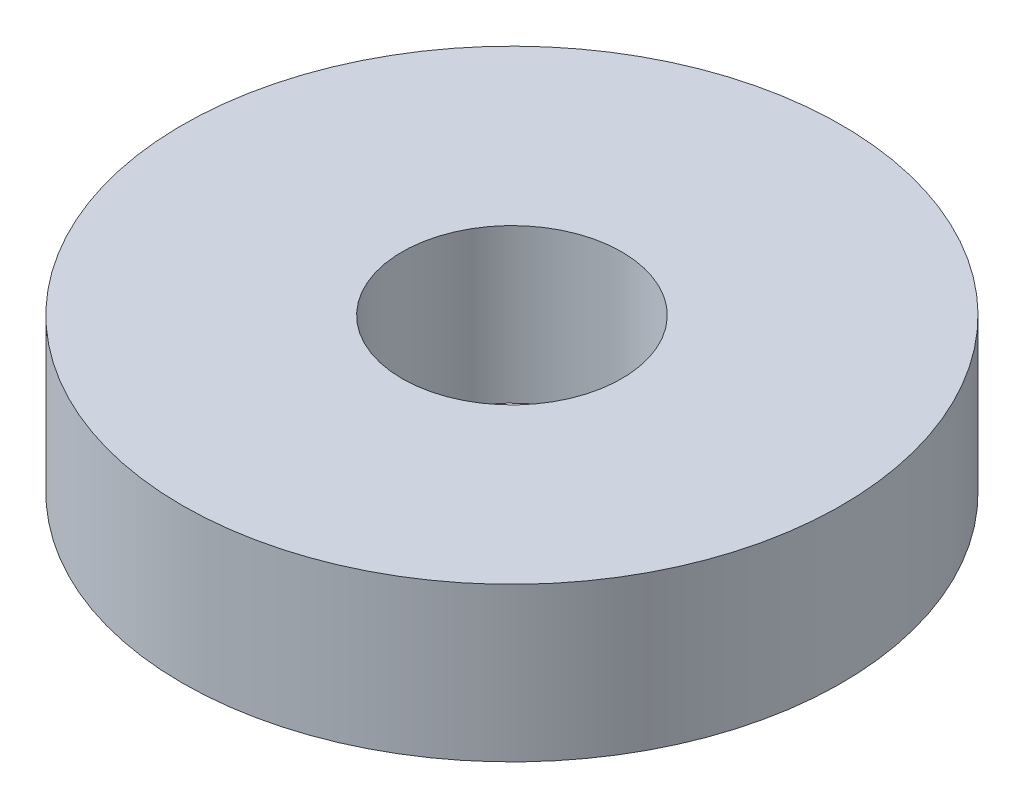
ISO-10303-21;
HEADER;
FILE_DESCRIPTION(('STEP AP214'),'2;1');
FILE_NAME('part.step','',(''),(''),'','','');
FILE_SCHEMA(('AUTOMOTIVE_DESIGN { 1 0 10303 214 1 1 1 1 }'));
ENDSEC;
DATA;
#1=APPLICATION_CONTEXT('core data for automotive mechanical design processes');
#2=APPLICATION_PROTOCOL_DEFINITION('international standard','automotive_design',2000,#1);
#3=PRODUCT_CONTEXT('',#1,'mechanical');
#4=PRODUCT('Part','Part','',(#3));
#5=PRODUCT_RELATED_PRODUCT_CATEGORY('part','',(#4));
#6=PRODUCT_DEFINITION_FORMATION('','',#4);
#7=PRODUCT_DEFINITION_CONTEXT('part definition',#1,'design');
#8=PRODUCT_DEFINITION('design','',#6,#7);
#9=PRODUCT_DEFINITION_SHAPE('','',#8);
#10=(LENGTH_UNIT() NAMED_UNIT(*) SI_UNIT(.MILLI.,.METRE.));
#11=(NAMED_UNIT(*) PLANE_ANGLE_UNIT() SI_UNIT($,.RADIAN.));
#12=(NAMED_UNIT(*) SI_UNIT($,.STERADIAN.) SOLID_ANGLE_UNIT());
#13=UNCERTAINTY_MEASURE_WITH_UNIT(LENGTH_MEASURE(1.E-05),#10,'distance_accuracy_value','');
#14=(GEOMETRIC_REPRESENTATION_CONTEXT(3) GLOBAL_UNCERTAINTY_ASSIGNED_CONTEXT((#13)) GLOBAL_UNIT_ASSIGNED_CONTEXT((#10,
#11,#12)) REPRESENTATION_CONTEXT('',''));
#15=CARTESIAN_POINT('',(0.,0.,0.));
#16=DIRECTION('',(0.,0.,1.));
#17=DIRECTION('',(1.,0.,0.));
#18=AXIS2_PLACEMENT_3D('',#15,#16,#17);
#19=CARTESIAN_POINT('',(0.,3.5,0.));
#20=DIRECTION('',(0.,1.,0.));
#21=DIRECTION('',(0.,0.,1.));
#22=AXIS2_PLACEMENT_3D('',#19,#20,#21);
#23=PLANE('',#22);
#24=CARTESIAN_POINT('',(0.,3.5,0.));
#25=DIRECTION('',(0.,1.,0.));
#26=DIRECTION('',(0.,0.,1.));
#27=AXIS2_PLACEMENT_3D('',#24,#25,#26);
#28=CIRCLE('',#27,7.5);
#29=CARTESIAN_POINT('',(0.,3.5,7.5));
#30=VERTEX_POINT('',#29);
#31=EDGE_CURVE('E10',#30,#30,#28,.T.);
#32=ORIENTED_EDGE('',*,*,#31,.T.);
#33=EDGE_LOOP('',(#32));
#34=FACE_BOUND('',#33,.T.);
#35=CARTESIAN_POINT('',(0.,3.5,0.));
#36=DIRECTION('',(0.,1.,0.));
#37=DIRECTION('',(0.,0.,1.));
#38=AXIS2_PLACEMENT_3D('',#35,#36,#37);
#39=CIRCLE('',#38,2.5);
#40=CARTESIAN_POINT('',(0.,3.5,2.5));
#41=VERTEX_POINT('',#40);
#42=EDGE_CURVE('E50',#41,#41,#39,.T.);
#43=ORIENTED_EDGE('',*,*,#42,.F.);
#44=EDGE_LOOP('',(#43));
#45=FACE_BOUND('',#44,.T.);
#46=ADVANCED_FACE('F39',(#34,#45),#23,.T.);
#47=CARTESIAN_POINT('',(0.,0.,0.));
#48=DIRECTION('',(0.,1.,0.));
#49=DIRECTION('',(0.,0.,1.));
#50=AXIS2_PLACEMENT_3D('',#47,#48,#49);
#51=PLANE('',#50);
#52=CARTESIAN_POINT('',(0.,0.,0.));
#53=DIRECTION('',(0.,1.,0.));
#54=DIRECTION('',(0.,0.,1.));
#55=AXIS2_PLACEMENT_3D('',#52,#53,#54);
#56=CIRCLE('',#55,7.5);
#57=CARTESIAN_POINT('',(0.,0.,7.5));
#58=VERTEX_POINT('',#57);
#59=EDGE_CURVE('E43',#58,#58,#56,.T.);
#60=ORIENTED_EDGE('',*,*,#59,.F.);
#61=EDGE_LOOP('',(#60));
#62=FACE_BOUND('',#61,.T.);
#63=CARTESIAN_POINT('',(0.,0.,0.));
#64=DIRECTION('',(0.,1.,0.));
#65=DIRECTION('',(0.,0.,1.));
#66=AXIS2_PLACEMENT_3D('',#63,#64,#65);
#67=CIRCLE('',#66,2.5);
#68=CARTESIAN_POINT('',(0.,0.,2.5));
#69=VERTEX_POINT('',#68);
#70=EDGE_CURVE('E52',#69,#69,#67,.T.);
#71=ORIENTED_EDGE('',*,*,#70,.T.);
#72=EDGE_LOOP('',(#71));
#73=FACE_BOUND('',#72,.T.);
#74=ADVANCED_FACE('F62',(#62,#73),#51,.F.);
#75=CARTESIAN_POINT('',(0.,3.5,0.));
#76=DIRECTION('',(0.,-1.,0.));
#77=DIRECTION('',(0.,0.,-1.));
#78=AXIS2_PLACEMENT_3D('',#75,#76,#77);
#79=CYLINDRICAL_SURFACE('',#78,7.5);
#80=ORIENTED_EDGE('',*,*,#31,.F.);
#81=EDGE_LOOP('',(#80));
#82=FACE_BOUND('',#81,.T.);
#83=ORIENTED_EDGE('',*,*,#59,.T.);
#84=EDGE_LOOP('',(#83));
#85=FACE_BOUND('',#84,.T.);
#86=ADVANCED_FACE('F41',(#82,#85),#79,.T.);
#87=CARTESIAN_POINT('',(0.,3.5,0.));
#88=DIRECTION('',(0.,-1.,0.));
#89=DIRECTION('',(0.,0.,-1.));
#90=AXIS2_PLACEMENT_3D('',#87,#88,#89);
#91=CYLINDRICAL_SURFACE('',#90,2.5);
#92=ORIENTED_EDGE('',*,*,#42,.T.);
#93=EDGE_LOOP('',(#92));
#94=FACE_BOUND('',#93,.T.);
#95=ORIENTED_EDGE('',*,*,#70,.F.);
#96=EDGE_LOOP('',(#95));
#97=FACE_BOUND('',#96,.T.);
#98=ADVANCED_FACE('F58',(#94,#97),#91,.F.);
#99=CLOSED_SHELL('',(#46,#74,#86,#98));
#100=MANIFOLD_SOLID_BREP('B2',#99);
#101=ADVANCED_BREP_SHAPE_REPRESENTATION('',(#18,#100),#14);
#102=SHAPE_DEFINITION_REPRESENTATION(#9,#101);
ENDSEC;
END-ISO-10303-21;
